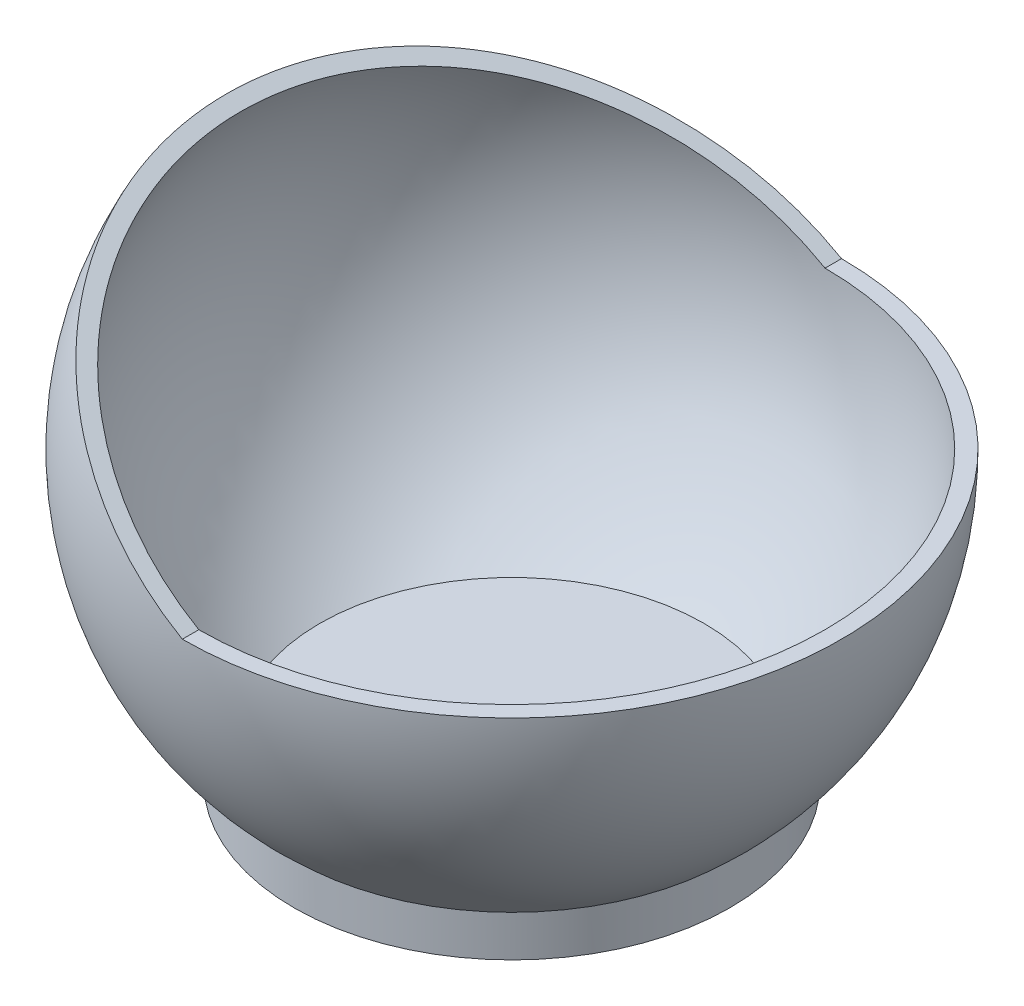
ISO-10303-21;
HEADER;
FILE_DESCRIPTION(('STEP AP214'),'2;1');
FILE_NAME('part.step','',(''),(''),'','','');
FILE_SCHEMA(('AUTOMOTIVE_DESIGN { 1 0 10303 214 1 1 1 1 }'));
ENDSEC;
DATA;
#1=APPLICATION_CONTEXT('core data for automotive mechanical design processes');
#2=APPLICATION_PROTOCOL_DEFINITION('international standard','automotive_design',2000,#1);
#3=PRODUCT_CONTEXT('',#1,'mechanical');
#4=PRODUCT('Part','Part','',(#3));
#5=PRODUCT_RELATED_PRODUCT_CATEGORY('part','',(#4));
#6=PRODUCT_DEFINITION_FORMATION('','',#4);
#7=PRODUCT_DEFINITION_CONTEXT('part definition',#1,'design');
#8=PRODUCT_DEFINITION('design','',#6,#7);
#9=PRODUCT_DEFINITION_SHAPE('','',#8);
#10=(LENGTH_UNIT() NAMED_UNIT(*) SI_UNIT(.MILLI.,.METRE.));
#11=(NAMED_UNIT(*) PLANE_ANGLE_UNIT() SI_UNIT($,.RADIAN.));
#12=(NAMED_UNIT(*) SI_UNIT($,.STERADIAN.) SOLID_ANGLE_UNIT());
#13=UNCERTAINTY_MEASURE_WITH_UNIT(LENGTH_MEASURE(1.E-05),#10,'distance_accuracy_value','');
#14=(GEOMETRIC_REPRESENTATION_CONTEXT(3) GLOBAL_UNCERTAINTY_ASSIGNED_CONTEXT((#13)) GLOBAL_UNIT_ASSIGNED_CONTEXT((#10,
#11,#12)) REPRESENTATION_CONTEXT('',''));
#15=CARTESIAN_POINT('',(0.,0.,0.));
#16=DIRECTION('',(0.,0.,1.));
#17=DIRECTION('',(1.,0.,0.));
#18=AXIS2_PLACEMENT_3D('',#15,#16,#17);
#19=CARTESIAN_POINT('',(0.,0.,0.));
#20=DIRECTION('',(0.,1.,0.));
#21=DIRECTION('',(1.,0.,0.));
#22=AXIS2_PLACEMENT_3D('',#19,#20,#21);
#23=SPHERICAL_SURFACE('',#22,40.);
#24=CARTESIAN_POINT('',(0.,0.,0.));
#25=DIRECTION('',(0.,-1.,0.));
#26=DIRECTION('',(0.,0.,-1.));
#27=AXIS2_PLACEMENT_3D('',#24,#25,#26);
#28=CIRCLE('',#27,40.);
#29=CARTESIAN_POINT('',(0.,0.,-40.));
#30=VERTEX_POINT('',#29);
#31=CARTESIAN_POINT('',(0.,0.,40.));
#32=VERTEX_POINT('',#31);
#33=EDGE_CURVE('E55',#30,#32,#28,.T.);
#34=ORIENTED_EDGE('',*,*,#33,.T.);
#35=CARTESIAN_POINT('',(0.,0.,0.));
#36=DIRECTION('',(-0.499999999999995,-0.866025403784442,0.));
#37=DIRECTION('',(0.866025403784442,-0.499999999999995,0.));
#38=AXIS2_PLACEMENT_3D('',#35,#36,#37);
#39=CIRCLE('',#38,40.);
#40=EDGE_CURVE('E125',#32,#30,#39,.T.);
#41=ORIENTED_EDGE('',*,*,#40,.T.);
#42=EDGE_LOOP('',(#34,#41));
#43=FACE_BOUND('',#42,.T.);
#44=CARTESIAN_POINT('',(0.,0.,-5.));
#45=DIRECTION('',(0.,0.,1.));
#46=DIRECTION('',(1.,0.,0.));
#47=AXIS2_PLACEMENT_3D('',#44,#45,#46);
#48=CIRCLE('',#47,39.6862696659689);
#49=CARTESIAN_POINT('',(-31.4575131106459,-24.1955547341561,-5.));
#50=VERTEX_POINT('',#49);
#51=CARTESIAN_POINT('',(-25.9807621135332,-30.,-5.));
#52=VERTEX_POINT('',#51);
#53=EDGE_CURVE('E114',#50,#52,#48,.T.);
#54=ORIENTED_EDGE('',*,*,#53,.F.);
#55=CARTESIAN_POINT('',(-31.4575131106459,0.,0.));
#56=DIRECTION('',(-1.,0.,0.));
#57=DIRECTION('',(0.,0.,1.));
#58=AXIS2_PLACEMENT_3D('',#55,#56,#57);
#59=CIRCLE('',#58,24.7067777926127);
#60=CARTESIAN_POINT('',(-31.4575131106459,-24.1955547341561,5.));
#61=VERTEX_POINT('',#60);
#62=EDGE_CURVE('E11',#50,#61,#59,.T.);
#63=ORIENTED_EDGE('',*,*,#62,.T.);
#64=CARTESIAN_POINT('',(0.,0.,5.));
#65=DIRECTION('',(0.,0.,1.));
#66=DIRECTION('',(1.,0.,0.));
#67=AXIS2_PLACEMENT_3D('',#64,#65,#66);
#68=CIRCLE('',#67,39.6862696659689);
#69=CARTESIAN_POINT('',(-25.9807621135332,-30.,5.));
#70=VERTEX_POINT('',#69);
#71=EDGE_CURVE('E88',#61,#70,#68,.T.);
#72=ORIENTED_EDGE('',*,*,#71,.T.);
#73=CARTESIAN_POINT('',(0.,-30.,0.));
#74=DIRECTION('',(0.,-1.,0.));
#75=DIRECTION('',(0.,0.,-1.));
#76=AXIS2_PLACEMENT_3D('',#73,#74,#75);
#77=CIRCLE('',#76,26.4575131106459);
#78=EDGE_CURVE('E116',#52,#70,#77,.T.);
#79=ORIENTED_EDGE('',*,*,#78,.F.);
#80=EDGE_LOOP('',(#54,#63,#72,#79));
#81=FACE_BOUND('',#80,.T.);
#82=ADVANCED_FACE('F33',(#43,#81),#23,.T.);
#83=CARTESIAN_POINT('',(0.,-35.,0.));
#84=DIRECTION('',(0.,1.,0.));
#85=DIRECTION('',(0.,0.,1.));
#86=AXIS2_PLACEMENT_3D('',#83,#84,#85);
#87=CYLINDRICAL_SURFACE('',#86,26.4575131106459);
#88=DIRECTION('',(0.,1.,0.));
#89=VECTOR('',#88,1.);
#90=CARTESIAN_POINT('',(-25.9807621135332,-35.,-5.));
#91=LINE('',#90,#89);
#92=CARTESIAN_POINT('',(-25.9807621135332,-35.,-5.));
#93=VERTEX_POINT('',#92);
#94=EDGE_CURVE('E112',#52,#93,#91,.F.);
#95=ORIENTED_EDGE('',*,*,#94,.F.);
#96=ORIENTED_EDGE('',*,*,#78,.T.);
#97=DIRECTION('',(0.,1.,0.));
#98=VECTOR('',#97,1.);
#99=CARTESIAN_POINT('',(-25.9807621135332,-35.,5.));
#100=LINE('',#99,#98);
#101=CARTESIAN_POINT('',(-25.9807621135332,-35.,5.));
#102=VERTEX_POINT('',#101);
#103=EDGE_CURVE('E99',#70,#102,#100,.F.);
#104=ORIENTED_EDGE('',*,*,#103,.T.);
#105=CARTESIAN_POINT('',(0.,-35.,0.));
#106=DIRECTION('',(0.,-1.,0.));
#107=DIRECTION('',(0.,0.,-1.));
#108=AXIS2_PLACEMENT_3D('',#105,#106,#107);
#109=CIRCLE('',#108,26.4575131106459);
#110=EDGE_CURVE('E105',#93,#102,#109,.T.);
#111=ORIENTED_EDGE('',*,*,#110,.F.);
#112=EDGE_LOOP('',(#95,#96,#104,#111));
#113=FACE_BOUND('',#112,.T.);
#114=ADVANCED_FACE('F154',(#113),#87,.T.);
#115=CARTESIAN_POINT('',(0.,0.,0.));
#116=DIRECTION('',(0.,1.,0.));
#117=DIRECTION('',(-1.,0.,0.));
#118=AXIS2_PLACEMENT_3D('',#115,#116,#117);
#119=SPHERICAL_SURFACE('',#118,38.);
#120=CARTESIAN_POINT('',(0.,0.,0.));
#121=DIRECTION('',(0.,-1.,0.));
#122=DIRECTION('',(0.,0.,-1.));
#123=AXIS2_PLACEMENT_3D('',#120,#121,#122);
#124=CIRCLE('',#123,38.);
#125=CARTESIAN_POINT('',(0.,0.,38.));
#126=VERTEX_POINT('',#125);
#127=CARTESIAN_POINT('',(0.,0.,-38.));
#128=VERTEX_POINT('',#127);
#129=EDGE_CURVE('E127',#126,#128,#124,.F.);
#130=ORIENTED_EDGE('',*,*,#129,.T.);
#131=CARTESIAN_POINT('',(0.,0.,0.));
#132=DIRECTION('',(-0.499999999999995,-0.866025403784442,0.));
#133=DIRECTION('',(0.866025403784442,-0.499999999999995,0.));
#134=AXIS2_PLACEMENT_3D('',#131,#132,#133);
#135=CIRCLE('',#134,38.);
#136=EDGE_CURVE('E41',#128,#126,#135,.F.);
#137=ORIENTED_EDGE('',*,*,#136,.T.);
#138=EDGE_LOOP('',(#130,#137));
#139=FACE_BOUND('',#138,.T.);
#140=CARTESIAN_POINT('',(0.,-30.,0.));
#141=DIRECTION('',(0.,1.,0.));
#142=DIRECTION('',(0.,0.,1.));
#143=AXIS2_PLACEMENT_3D('',#140,#141,#142);
#144=CIRCLE('',#143,23.3238075793812);
#145=CARTESIAN_POINT('',(0.,-30.,23.3238075793812));
#146=VERTEX_POINT('',#145);
#147=EDGE_CURVE('E118',#146,#146,#144,.F.);
#148=ORIENTED_EDGE('',*,*,#147,.T.);
#149=EDGE_LOOP('',(#148));
#150=FACE_BOUND('',#149,.T.);
#151=ADVANCED_FACE('F35',(#139,#150),#119,.F.);
#152=CARTESIAN_POINT('',(0.,0.,-40.));
#153=DIRECTION('',(-0.499999999999995,-0.866025403784442,0.));
#154=DIRECTION('',(0.866025403784442,-0.499999999999995,0.));
#155=AXIS2_PLACEMENT_3D('',#152,#153,#154);
#156=PLANE('',#155);
#157=DIRECTION('',(0.,0.,1.));
#158=VECTOR('',#157,1.);
#159=CARTESIAN_POINT('',(0.,0.,-40.));
#160=LINE('',#159,#158);
#161=EDGE_CURVE('E123',#126,#32,#160,.T.);
#162=ORIENTED_EDGE('',*,*,#161,.F.);
#163=ORIENTED_EDGE('',*,*,#136,.F.);
#164=EDGE_CURVE('E121',#30,#128,#160,.T.);
#165=ORIENTED_EDGE('',*,*,#164,.F.);
#166=ORIENTED_EDGE('',*,*,#40,.F.);
#167=EDGE_LOOP('',(#162,#163,#165,#166));
#168=FACE_BOUND('',#167,.T.);
#169=ADVANCED_FACE('F138',(#168),#156,.F.);
#170=CARTESIAN_POINT('',(0.,0.,-40.));
#171=DIRECTION('',(0.,-1.,0.));
#172=DIRECTION('',(0.,0.,-1.));
#173=AXIS2_PLACEMENT_3D('',#170,#171,#172);
#174=PLANE('',#173);
#175=ORIENTED_EDGE('',*,*,#164,.T.);
#176=ORIENTED_EDGE('',*,*,#129,.F.);
#177=ORIENTED_EDGE('',*,*,#161,.T.);
#178=ORIENTED_EDGE('',*,*,#33,.F.);
#179=EDGE_LOOP('',(#175,#176,#177,#178));
#180=FACE_BOUND('',#179,.T.);
#181=ADVANCED_FACE('F141',(#180),#174,.F.);
#182=CARTESIAN_POINT('',(0.,-30.,0.));
#183=DIRECTION('',(0.,-1.,0.));
#184=DIRECTION('',(0.,0.,-1.));
#185=AXIS2_PLACEMENT_3D('',#182,#183,#184);
#186=PLANE('',#185);
#187=ORIENTED_EDGE('',*,*,#147,.F.);
#188=EDGE_LOOP('',(#187));
#189=FACE_BOUND('',#188,.T.);
#190=ADVANCED_FACE('F143',(#189),#186,.F.);
#191=CARTESIAN_POINT('',(0.,-35.,0.));
#192=DIRECTION('',(0.,-1.,0.));
#193=DIRECTION('',(0.,0.,-1.));
#194=AXIS2_PLACEMENT_3D('',#191,#192,#193);
#195=PLANE('',#194);
#196=ORIENTED_EDGE('',*,*,#110,.T.);
#197=DIRECTION('',(1.,0.,0.));
#198=VECTOR('',#197,1.);
#199=CARTESIAN_POINT('',(-17.2046505340853,-35.,5.));
#200=LINE('',#199,#198);
#201=CARTESIAN_POINT('',(-31.4575131106459,-35.,5.));
#202=VERTEX_POINT('',#201);
#203=EDGE_CURVE('E48',#202,#102,#200,.T.);
#204=ORIENTED_EDGE('',*,*,#203,.F.);
#205=DIRECTION('',(0.,0.,1.));
#206=VECTOR('',#205,1.);
#207=CARTESIAN_POINT('',(-31.4575131106459,-35.,-5.));
#208=LINE('',#207,#206);
#209=CARTESIAN_POINT('',(-31.4575131106459,-35.,-5.));
#210=VERTEX_POINT('',#209);
#211=EDGE_CURVE('E92',#210,#202,#208,.T.);
#212=ORIENTED_EDGE('',*,*,#211,.F.);
#213=DIRECTION('',(1.,0.,0.));
#214=VECTOR('',#213,1.);
#215=CARTESIAN_POINT('',(-17.2046505340853,-35.,-5.));
#216=LINE('',#215,#214);
#217=EDGE_CURVE('E100',#210,#93,#216,.T.);
#218=ORIENTED_EDGE('',*,*,#217,.T.);
#219=EDGE_LOOP('',(#196,#204,#212,#218));
#220=FACE_BOUND('',#219,.T.);
#221=ADVANCED_FACE('F103',(#220),#195,.T.);
#222=CARTESIAN_POINT('',(0.,0.,-5.));
#223=DIRECTION('',(0.,0.,1.));
#224=DIRECTION('',(1.,0.,0.));
#225=AXIS2_PLACEMENT_3D('',#222,#223,#224);
#226=PLANE('',#225);
#227=DIRECTION('',(0.,-1.,0.));
#228=VECTOR('',#227,1.);
#229=CARTESIAN_POINT('',(-31.4575131106459,-35.,-5.));
#230=LINE('',#229,#228);
#231=EDGE_CURVE('E95',#50,#210,#230,.T.);
#232=ORIENTED_EDGE('',*,*,#231,.F.);
#233=ORIENTED_EDGE('',*,*,#53,.T.);
#234=ORIENTED_EDGE('',*,*,#94,.T.);
#235=ORIENTED_EDGE('',*,*,#217,.F.);
#236=EDGE_LOOP('',(#232,#233,#234,#235));
#237=FACE_BOUND('',#236,.T.);
#238=ADVANCED_FACE('F164',(#237),#226,.F.);
#239=CARTESIAN_POINT('',(0.,0.,5.));
#240=DIRECTION('',(0.,0.,1.));
#241=DIRECTION('',(1.,0.,0.));
#242=AXIS2_PLACEMENT_3D('',#239,#240,#241);
#243=PLANE('',#242);
#244=ORIENTED_EDGE('',*,*,#71,.F.);
#245=DIRECTION('',(0.,-1.,0.));
#246=VECTOR('',#245,1.);
#247=CARTESIAN_POINT('',(-31.4575131106459,-35.,5.));
#248=LINE('',#247,#246);
#249=EDGE_CURVE('E84',#61,#202,#248,.T.);
#250=ORIENTED_EDGE('',*,*,#249,.T.);
#251=ORIENTED_EDGE('',*,*,#203,.T.);
#252=ORIENTED_EDGE('',*,*,#103,.F.);
#253=EDGE_LOOP('',(#244,#250,#251,#252));
#254=FACE_BOUND('',#253,.T.);
#255=ADVANCED_FACE('F86',(#254),#243,.T.);
#256=CARTESIAN_POINT('',(-31.4575131106459,-35.,-5.));
#257=DIRECTION('',(-1.,0.,0.));
#258=DIRECTION('',(0.,0.,1.));
#259=AXIS2_PLACEMENT_3D('',#256,#257,#258);
#260=PLANE('',#259);
#261=ORIENTED_EDGE('',*,*,#62,.F.);
#262=ORIENTED_EDGE('',*,*,#231,.T.);
#263=ORIENTED_EDGE('',*,*,#211,.T.);
#264=ORIENTED_EDGE('',*,*,#249,.F.);
#265=EDGE_LOOP('',(#261,#262,#263,#264));
#266=FACE_BOUND('',#265,.T.);
#267=ADVANCED_FACE('F93',(#266),#260,.T.);
#268=CLOSED_SHELL('',(#82,#114,#151,#169,#181,#190,#221,#238,#255,#267));
#269=MANIFOLD_SOLID_BREP('B2',#268);
#270=ADVANCED_BREP_SHAPE_REPRESENTATION('',(#18,#269),#14);
#271=SHAPE_DEFINITION_REPRESENTATION(#9,#270);
ENDSEC;
END-ISO-10303-21;
